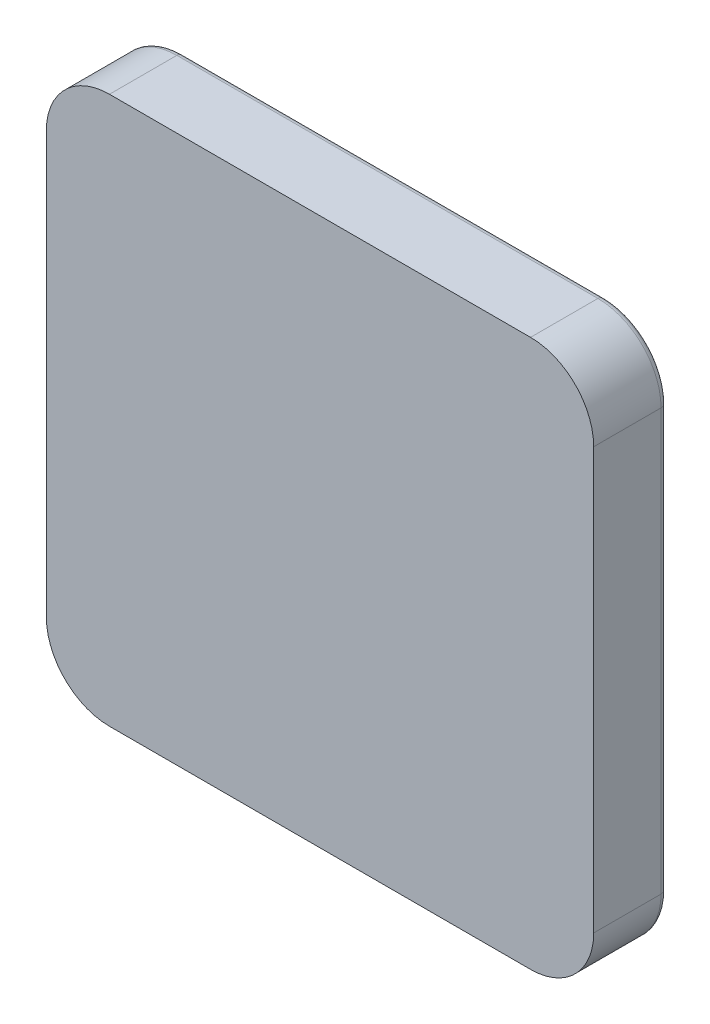
ISO-10303-21;
HEADER;
FILE_DESCRIPTION(('STEP AP214'),'2;1');
FILE_NAME('part.step','',(''),(''),'','','');
FILE_SCHEMA(('AUTOMOTIVE_DESIGN { 1 0 10303 214 1 1 1 1 }'));
ENDSEC;
DATA;
#1=APPLICATION_CONTEXT('core data for automotive mechanical design processes');
#2=APPLICATION_PROTOCOL_DEFINITION('international standard','automotive_design',2000,#1);
#3=PRODUCT_CONTEXT('',#1,'mechanical');
#4=PRODUCT('Part','Part','',(#3));
#5=PRODUCT_RELATED_PRODUCT_CATEGORY('part','',(#4));
#6=PRODUCT_DEFINITION_FORMATION('','',#4);
#7=PRODUCT_DEFINITION_CONTEXT('part definition',#1,'design');
#8=PRODUCT_DEFINITION('design','',#6,#7);
#9=PRODUCT_DEFINITION_SHAPE('','',#8);
#10=(LENGTH_UNIT() NAMED_UNIT(*) SI_UNIT(.MILLI.,.METRE.));
#11=(NAMED_UNIT(*) PLANE_ANGLE_UNIT() SI_UNIT($,.RADIAN.));
#12=(NAMED_UNIT(*) SI_UNIT($,.STERADIAN.) SOLID_ANGLE_UNIT());
#13=UNCERTAINTY_MEASURE_WITH_UNIT(LENGTH_MEASURE(1.E-05),#10,'distance_accuracy_value','');
#14=(GEOMETRIC_REPRESENTATION_CONTEXT(3) GLOBAL_UNCERTAINTY_ASSIGNED_CONTEXT((#13)) GLOBAL_UNIT_ASSIGNED_CONTEXT((#10,
#11,#12)) REPRESENTATION_CONTEXT('',''));
#15=CARTESIAN_POINT('',(0.,0.,0.));
#16=DIRECTION('',(0.,0.,1.));
#17=DIRECTION('',(1.,0.,0.));
#18=AXIS2_PLACEMENT_3D('',#15,#16,#17);
#19=CARTESIAN_POINT('',(1.,1.,-0.35));
#20=DIRECTION('',(0.,0.,-1.));
#21=DIRECTION('',(-1.,0.,0.));
#22=AXIS2_PLACEMENT_3D('',#19,#20,#21);
#23=PLANE('',#22);
#24=CARTESIAN_POINT('',(1.,1.,-0.35));
#25=DIRECTION('',(0.,0.,1.));
#26=DIRECTION('',(1.,0.,0.));
#27=AXIS2_PLACEMENT_3D('',#24,#25,#26);
#28=CIRCLE('',#27,0.27);
#29=CARTESIAN_POINT('',(1.,1.27,-0.35));
#30=VERTEX_POINT('',#29);
#31=CARTESIAN_POINT('',(1.27,1.,-0.35));
#32=VERTEX_POINT('',#31);
#33=EDGE_CURVE('E229',#30,#32,#28,.F.);
#34=ORIENTED_EDGE('',*,*,#33,.T.);
#35=DIRECTION('',(0.,1.,0.));
#36=VECTOR('',#35,1.);
#37=CARTESIAN_POINT('',(1.27,1.,-0.35));
#38=LINE('',#37,#36);
#39=CARTESIAN_POINT('',(1.27,-1.,-0.35));
#40=VERTEX_POINT('',#39);
#41=EDGE_CURVE('E238',#40,#32,#38,.T.);
#42=ORIENTED_EDGE('',*,*,#41,.F.);
#43=CARTESIAN_POINT('',(1.,-1.,-0.35));
#44=DIRECTION('',(0.,0.,1.));
#45=DIRECTION('',(0.,-1.,0.));
#46=AXIS2_PLACEMENT_3D('',#43,#44,#45);
#47=CIRCLE('',#46,0.27);
#48=CARTESIAN_POINT('',(1.,-1.27,-0.35));
#49=VERTEX_POINT('',#48);
#50=EDGE_CURVE('E330',#49,#40,#47,.T.);
#51=ORIENTED_EDGE('',*,*,#50,.F.);
#52=DIRECTION('',(1.,0.,0.));
#53=VECTOR('',#52,1.);
#54=CARTESIAN_POINT('',(1.,-1.27,-0.35));
#55=LINE('',#54,#53);
#56=CARTESIAN_POINT('',(-1.,-1.27,-0.35));
#57=VERTEX_POINT('',#56);
#58=EDGE_CURVE('E283',#57,#49,#55,.T.);
#59=ORIENTED_EDGE('',*,*,#58,.F.);
#60=CARTESIAN_POINT('',(-1.,-1.,-0.35));
#61=DIRECTION('',(0.,0.,1.));
#62=DIRECTION('',(-1.,0.,0.));
#63=AXIS2_PLACEMENT_3D('',#60,#61,#62);
#64=CIRCLE('',#63,0.27);
#65=CARTESIAN_POINT('',(-1.27,-1.,-0.35));
#66=VERTEX_POINT('',#65);
#67=EDGE_CURVE('E291',#66,#57,#64,.T.);
#68=ORIENTED_EDGE('',*,*,#67,.F.);
#69=DIRECTION('',(0.,-1.,0.));
#70=VECTOR('',#69,1.);
#71=CARTESIAN_POINT('',(-1.27,1.,-0.35));
#72=LINE('',#71,#70);
#73=CARTESIAN_POINT('',(-1.27,1.,-0.35));
#74=VERTEX_POINT('',#73);
#75=EDGE_CURVE('E323',#74,#66,#72,.T.);
#76=ORIENTED_EDGE('',*,*,#75,.F.);
#77=CARTESIAN_POINT('',(-1.,1.,-0.35));
#78=DIRECTION('',(0.,0.,1.));
#79=DIRECTION('',(0.,1.,0.));
#80=AXIS2_PLACEMENT_3D('',#77,#78,#79);
#81=CIRCLE('',#80,0.27);
#82=CARTESIAN_POINT('',(-1.,1.27,-0.35));
#83=VERTEX_POINT('',#82);
#84=EDGE_CURVE('E242',#83,#74,#81,.T.);
#85=ORIENTED_EDGE('',*,*,#84,.F.);
#86=DIRECTION('',(-1.,0.,0.));
#87=VECTOR('',#86,1.);
#88=CARTESIAN_POINT('',(1.,1.27,-0.35));
#89=LINE('',#88,#87);
#90=EDGE_CURVE('E240',#30,#83,#89,.T.);
#91=ORIENTED_EDGE('',*,*,#90,.F.);
#92=EDGE_LOOP('',(#34,#42,#51,#59,#68,#76,#85,#91));
#93=FACE_BOUND('',#92,.T.);
#94=ADVANCED_FACE('F17',(#93),#23,.T.);
#95=CARTESIAN_POINT('',(1.27,1.,-0.32));
#96=DIRECTION('',(0.,1.,0.));
#97=DIRECTION('',(0.,0.,1.));
#98=AXIS2_PLACEMENT_3D('',#95,#96,#97);
#99=CYLINDRICAL_SURFACE('',#98,0.03);
#100=CARTESIAN_POINT('',(1.27,-1.,-0.32));
#101=DIRECTION('',(0.,-1.,0.));
#102=DIRECTION('',(1.,0.,0.));
#103=AXIS2_PLACEMENT_3D('',#100,#101,#102);
#104=CIRCLE('',#103,0.03);
#105=CARTESIAN_POINT('',(1.3,-1.,-0.32));
#106=VERTEX_POINT('',#105);
#107=EDGE_CURVE('E335',#40,#106,#104,.T.);
#108=ORIENTED_EDGE('',*,*,#107,.F.);
#109=ORIENTED_EDGE('',*,*,#41,.T.);
#110=CARTESIAN_POINT('',(1.27,1.,-0.32));
#111=DIRECTION('',(0.,-1.,0.));
#112=DIRECTION('',(1.,0.,0.));
#113=AXIS2_PLACEMENT_3D('',#110,#111,#112);
#114=CIRCLE('',#113,0.03);
#115=CARTESIAN_POINT('',(1.3,1.,-0.32));
#116=VERTEX_POINT('',#115);
#117=EDGE_CURVE('E237',#116,#32,#114,.F.);
#118=ORIENTED_EDGE('',*,*,#117,.F.);
#119=DIRECTION('',(0.,1.,0.));
#120=VECTOR('',#119,1.);
#121=CARTESIAN_POINT('',(1.3,1.,-0.32));
#122=LINE('',#121,#120);
#123=EDGE_CURVE('E249',#106,#116,#122,.T.);
#124=ORIENTED_EDGE('',*,*,#123,.F.);
#125=EDGE_LOOP('',(#108,#109,#118,#124));
#126=FACE_BOUND('',#125,.T.);
#127=ADVANCED_FACE('F340',(#126),#99,.T.);
#128=CARTESIAN_POINT('',(1.,-1.,-0.32));
#129=DIRECTION('',(0.,0.,-1.));
#130=DIRECTION('',(-1.,0.,0.));
#131=AXIS2_PLACEMENT_3D('',#128,#129,#130);
#132=TOROIDAL_SURFACE('',#131,0.27,0.03);
#133=CARTESIAN_POINT('',(1.,-1.27,-0.32));
#134=DIRECTION('',(1.,0.,0.));
#135=DIRECTION('',(0.,1.,0.));
#136=AXIS2_PLACEMENT_3D('',#133,#134,#135);
#137=CIRCLE('',#136,0.03);
#138=CARTESIAN_POINT('',(1.,-1.3,-0.32));
#139=VERTEX_POINT('',#138);
#140=EDGE_CURVE('E292',#49,#139,#137,.F.);
#141=ORIENTED_EDGE('',*,*,#140,.F.);
#142=ORIENTED_EDGE('',*,*,#50,.T.);
#143=ORIENTED_EDGE('',*,*,#107,.T.);
#144=CARTESIAN_POINT('',(1.,-1.,-0.32));
#145=DIRECTION('',(0.,0.,1.));
#146=DIRECTION('',(1.,0.,0.));
#147=AXIS2_PLACEMENT_3D('',#144,#145,#146);
#148=CIRCLE('',#147,0.3);
#149=EDGE_CURVE('E126',#139,#106,#148,.T.);
#150=ORIENTED_EDGE('',*,*,#149,.F.);
#151=EDGE_LOOP('',(#141,#142,#143,#150));
#152=FACE_BOUND('',#151,.T.);
#153=ADVANCED_FACE('F337',(#152),#132,.T.);
#154=CARTESIAN_POINT('',(1.,-1.27,-0.32));
#155=DIRECTION('',(1.,0.,0.));
#156=DIRECTION('',(0.,1.,0.));
#157=AXIS2_PLACEMENT_3D('',#154,#155,#156);
#158=CYLINDRICAL_SURFACE('',#157,0.03);
#159=CARTESIAN_POINT('',(-1.,-1.27,-0.32));
#160=DIRECTION('',(-1.,0.,0.));
#161=DIRECTION('',(0.,-1.,0.));
#162=AXIS2_PLACEMENT_3D('',#159,#160,#161);
#163=CIRCLE('',#162,0.03);
#164=CARTESIAN_POINT('',(-1.,-1.3,-0.32));
#165=VERTEX_POINT('',#164);
#166=EDGE_CURVE('E321',#57,#165,#163,.T.);
#167=ORIENTED_EDGE('',*,*,#166,.F.);
#168=ORIENTED_EDGE('',*,*,#58,.T.);
#169=ORIENTED_EDGE('',*,*,#140,.T.);
#170=DIRECTION('',(1.,0.,0.));
#171=VECTOR('',#170,1.);
#172=CARTESIAN_POINT('',(1.,-1.3,-0.32));
#173=LINE('',#172,#171);
#174=EDGE_CURVE('E75',#165,#139,#173,.T.);
#175=ORIENTED_EDGE('',*,*,#174,.F.);
#176=EDGE_LOOP('',(#167,#168,#169,#175));
#177=FACE_BOUND('',#176,.T.);
#178=ADVANCED_FACE('F314',(#177),#158,.T.);
#179=CARTESIAN_POINT('',(-1.,-1.,-0.32));
#180=DIRECTION('',(0.,0.,-1.));
#181=DIRECTION('',(-1.,0.,0.));
#182=AXIS2_PLACEMENT_3D('',#179,#180,#181);
#183=TOROIDAL_SURFACE('',#182,0.27,0.03);
#184=ORIENTED_EDGE('',*,*,#166,.T.);
#185=CARTESIAN_POINT('',(-1.,-1.,-0.32));
#186=DIRECTION('',(0.,0.,1.));
#187=DIRECTION('',(1.,0.,0.));
#188=AXIS2_PLACEMENT_3D('',#185,#186,#187);
#189=CIRCLE('',#188,0.3);
#190=CARTESIAN_POINT('',(-1.3,-1.,-0.32));
#191=VERTEX_POINT('',#190);
#192=EDGE_CURVE('E77',#191,#165,#189,.T.);
#193=ORIENTED_EDGE('',*,*,#192,.F.);
#194=CARTESIAN_POINT('',(-1.27,-1.,-0.32));
#195=DIRECTION('',(0.,-1.,0.));
#196=DIRECTION('',(0.,0.,-1.));
#197=AXIS2_PLACEMENT_3D('',#194,#195,#196);
#198=CIRCLE('',#197,0.03);
#199=EDGE_CURVE('E421',#66,#191,#198,.F.);
#200=ORIENTED_EDGE('',*,*,#199,.F.);
#201=ORIENTED_EDGE('',*,*,#67,.T.);
#202=EDGE_LOOP('',(#184,#193,#200,#201));
#203=FACE_BOUND('',#202,.T.);
#204=ADVANCED_FACE('F304',(#203),#183,.T.);
#205=CARTESIAN_POINT('',(-1.27,1.,-0.32));
#206=DIRECTION('',(0.,-1.,0.));
#207=DIRECTION('',(0.,0.,-1.));
#208=AXIS2_PLACEMENT_3D('',#205,#206,#207);
#209=CYLINDRICAL_SURFACE('',#208,0.03);
#210=ORIENTED_EDGE('',*,*,#199,.T.);
#211=DIRECTION('',(0.,1.,0.));
#212=VECTOR('',#211,1.);
#213=CARTESIAN_POINT('',(-1.3,1.,-0.32));
#214=LINE('',#213,#212);
#215=CARTESIAN_POINT('',(-1.3,1.,-0.32));
#216=VERTEX_POINT('',#215);
#217=EDGE_CURVE('E116',#216,#191,#214,.F.);
#218=ORIENTED_EDGE('',*,*,#217,.F.);
#219=CARTESIAN_POINT('',(-1.27,1.,-0.32));
#220=DIRECTION('',(0.,1.,0.));
#221=DIRECTION('',(-1.,0.,0.));
#222=AXIS2_PLACEMENT_3D('',#219,#220,#221);
#223=CIRCLE('',#222,0.03);
#224=EDGE_CURVE('E193',#74,#216,#223,.T.);
#225=ORIENTED_EDGE('',*,*,#224,.F.);
#226=ORIENTED_EDGE('',*,*,#75,.T.);
#227=EDGE_LOOP('',(#210,#218,#225,#226));
#228=FACE_BOUND('',#227,.T.);
#229=ADVANCED_FACE('F275',(#228),#209,.T.);
#230=CARTESIAN_POINT('',(-1.,1.,-0.32));
#231=DIRECTION('',(0.,0.,-1.));
#232=DIRECTION('',(-1.,0.,0.));
#233=AXIS2_PLACEMENT_3D('',#230,#231,#232);
#234=TOROIDAL_SURFACE('',#233,0.27,0.03);
#235=ORIENTED_EDGE('',*,*,#224,.T.);
#236=CARTESIAN_POINT('',(-1.,1.,-0.32));
#237=DIRECTION('',(0.,0.,1.));
#238=DIRECTION('',(1.,0.,0.));
#239=AXIS2_PLACEMENT_3D('',#236,#237,#238);
#240=CIRCLE('',#239,0.3);
#241=CARTESIAN_POINT('',(-1.,1.3,-0.32));
#242=VERTEX_POINT('',#241);
#243=EDGE_CURVE('E111',#242,#216,#240,.T.);
#244=ORIENTED_EDGE('',*,*,#243,.F.);
#245=CARTESIAN_POINT('',(-1.,1.27,-0.32));
#246=DIRECTION('',(-1.,0.,0.));
#247=DIRECTION('',(0.,0.,1.));
#248=AXIS2_PLACEMENT_3D('',#245,#246,#247);
#249=CIRCLE('',#248,0.03);
#250=EDGE_CURVE('E246',#83,#242,#249,.F.);
#251=ORIENTED_EDGE('',*,*,#250,.F.);
#252=ORIENTED_EDGE('',*,*,#84,.T.);
#253=EDGE_LOOP('',(#235,#244,#251,#252));
#254=FACE_BOUND('',#253,.T.);
#255=ADVANCED_FACE('F271',(#254),#234,.T.);
#256=CARTESIAN_POINT('',(1.,1.27,-0.32));
#257=DIRECTION('',(-1.,0.,0.));
#258=DIRECTION('',(0.,0.,1.));
#259=AXIS2_PLACEMENT_3D('',#256,#257,#258);
#260=CYLINDRICAL_SURFACE('',#259,0.03);
#261=ORIENTED_EDGE('',*,*,#250,.T.);
#262=DIRECTION('',(1.,0.,0.));
#263=VECTOR('',#262,1.);
#264=CARTESIAN_POINT('',(1.,1.3,-0.32));
#265=LINE('',#264,#263);
#266=CARTESIAN_POINT('',(1.,1.3,-0.32));
#267=VERTEX_POINT('',#266);
#268=EDGE_CURVE('E106',#267,#242,#265,.F.);
#269=ORIENTED_EDGE('',*,*,#268,.F.);
#270=CARTESIAN_POINT('',(1.,1.27,-0.32));
#271=DIRECTION('',(1.,0.,0.));
#272=DIRECTION('',(0.,1.,0.));
#273=AXIS2_PLACEMENT_3D('',#270,#271,#272);
#274=CIRCLE('',#273,0.03);
#275=EDGE_CURVE('E138',#30,#267,#274,.T.);
#276=ORIENTED_EDGE('',*,*,#275,.F.);
#277=ORIENTED_EDGE('',*,*,#90,.T.);
#278=EDGE_LOOP('',(#261,#269,#276,#277));
#279=FACE_BOUND('',#278,.T.);
#280=ADVANCED_FACE('F147',(#279),#260,.T.);
#281=CARTESIAN_POINT('',(1.,1.,-0.32));
#282=DIRECTION('',(0.,0.,-1.));
#283=DIRECTION('',(-1.,0.,0.));
#284=AXIS2_PLACEMENT_3D('',#281,#282,#283);
#285=TOROIDAL_SURFACE('',#284,0.27,0.03);
#286=ORIENTED_EDGE('',*,*,#275,.T.);
#287=CARTESIAN_POINT('',(1.,1.,-0.32));
#288=DIRECTION('',(0.,0.,1.));
#289=DIRECTION('',(1.,0.,0.));
#290=AXIS2_PLACEMENT_3D('',#287,#288,#289);
#291=CIRCLE('',#290,0.3);
#292=EDGE_CURVE('E93',#116,#267,#291,.T.);
#293=ORIENTED_EDGE('',*,*,#292,.F.);
#294=ORIENTED_EDGE('',*,*,#117,.T.);
#295=ORIENTED_EDGE('',*,*,#33,.F.);
#296=EDGE_LOOP('',(#286,#293,#294,#295));
#297=FACE_BOUND('',#296,.T.);
#298=ADVANCED_FACE('F141',(#297),#285,.T.);
#299=CARTESIAN_POINT('',(1.3,1.,-0.35));
#300=DIRECTION('',(1.,0.,0.));
#301=DIRECTION('',(0.,0.,-1.));
#302=AXIS2_PLACEMENT_3D('',#299,#300,#301);
#303=PLANE('',#302);
#304=DIRECTION('',(0.,0.,1.));
#305=VECTOR('',#304,1.);
#306=CARTESIAN_POINT('',(1.3,1.,-0.35));
#307=LINE('',#306,#305);
#308=CARTESIAN_POINT('',(1.3,1.,0.));
#309=VERTEX_POINT('',#308);
#310=EDGE_CURVE('E99',#309,#116,#307,.F.);
#311=ORIENTED_EDGE('',*,*,#310,.F.);
#312=DIRECTION('',(0.,1.,0.));
#313=VECTOR('',#312,1.);
#314=CARTESIAN_POINT('',(1.3,1.,0.));
#315=LINE('',#314,#313);
#316=CARTESIAN_POINT('',(1.3,-1.,0.));
#317=VERTEX_POINT('',#316);
#318=EDGE_CURVE('E89',#309,#317,#315,.F.);
#319=ORIENTED_EDGE('',*,*,#318,.T.);
#320=DIRECTION('',(0.,0.,1.));
#321=VECTOR('',#320,1.);
#322=CARTESIAN_POINT('',(1.3,-1.,-0.35));
#323=LINE('',#322,#321);
#324=EDGE_CURVE('E61',#106,#317,#323,.T.);
#325=ORIENTED_EDGE('',*,*,#324,.F.);
#326=ORIENTED_EDGE('',*,*,#123,.T.);
#327=EDGE_LOOP('',(#311,#319,#325,#326));
#328=FACE_BOUND('',#327,.T.);
#329=ADVANCED_FACE('F146',(#328),#303,.T.);
#330=CARTESIAN_POINT('',(1.,-1.,-0.35));
#331=DIRECTION('',(0.,0.,1.));
#332=DIRECTION('',(1.,0.,0.));
#333=AXIS2_PLACEMENT_3D('',#330,#331,#332);
#334=CYLINDRICAL_SURFACE('',#333,0.3);
#335=ORIENTED_EDGE('',*,*,#324,.T.);
#336=CARTESIAN_POINT('',(1.,-1.,0.));
#337=DIRECTION('',(0.,0.,1.));
#338=DIRECTION('',(1.,0.,0.));
#339=AXIS2_PLACEMENT_3D('',#336,#337,#338);
#340=CIRCLE('',#339,0.3);
#341=CARTESIAN_POINT('',(1.,-1.3,0.));
#342=VERTEX_POINT('',#341);
#343=EDGE_CURVE('E21',#317,#342,#340,.F.);
#344=ORIENTED_EDGE('',*,*,#343,.T.);
#345=DIRECTION('',(0.,0.,1.));
#346=VECTOR('',#345,1.);
#347=CARTESIAN_POINT('',(1.,-1.3,-0.35));
#348=LINE('',#347,#346);
#349=EDGE_CURVE('E68',#139,#342,#348,.T.);
#350=ORIENTED_EDGE('',*,*,#349,.F.);
#351=ORIENTED_EDGE('',*,*,#149,.T.);
#352=EDGE_LOOP('',(#335,#344,#350,#351));
#353=FACE_BOUND('',#352,.T.);
#354=ADVANCED_FACE('F88',(#353),#334,.T.);
#355=CARTESIAN_POINT('',(1.,-1.3,-0.35));
#356=DIRECTION('',(0.,-1.,0.));
#357=DIRECTION('',(1.,0.,0.));
#358=AXIS2_PLACEMENT_3D('',#355,#356,#357);
#359=PLANE('',#358);
#360=ORIENTED_EDGE('',*,*,#349,.T.);
#361=DIRECTION('',(-1.,0.,0.));
#362=VECTOR('',#361,1.);
#363=CARTESIAN_POINT('',(1.,-1.3,0.));
#364=LINE('',#363,#362);
#365=CARTESIAN_POINT('',(-1.,-1.3,0.));
#366=VERTEX_POINT('',#365);
#367=EDGE_CURVE('E72',#342,#366,#364,.T.);
#368=ORIENTED_EDGE('',*,*,#367,.T.);
#369=DIRECTION('',(0.,0.,1.));
#370=VECTOR('',#369,1.);
#371=CARTESIAN_POINT('',(-1.,-1.3,-0.35));
#372=LINE('',#371,#370);
#373=EDGE_CURVE('E119',#165,#366,#372,.T.);
#374=ORIENTED_EDGE('',*,*,#373,.F.);
#375=ORIENTED_EDGE('',*,*,#174,.T.);
#376=EDGE_LOOP('',(#360,#368,#374,#375));
#377=FACE_BOUND('',#376,.T.);
#378=ADVANCED_FACE('F70',(#377),#359,.T.);
#379=CARTESIAN_POINT('',(-1.,-1.,-0.35));
#380=DIRECTION('',(0.,0.,1.));
#381=DIRECTION('',(1.,0.,0.));
#382=AXIS2_PLACEMENT_3D('',#379,#380,#381);
#383=CYLINDRICAL_SURFACE('',#382,0.3);
#384=ORIENTED_EDGE('',*,*,#373,.T.);
#385=CARTESIAN_POINT('',(-1.,-1.,0.));
#386=DIRECTION('',(0.,0.,1.));
#387=DIRECTION('',(1.,0.,0.));
#388=AXIS2_PLACEMENT_3D('',#385,#386,#387);
#389=CIRCLE('',#388,0.3);
#390=CARTESIAN_POINT('',(-1.3,-1.,0.));
#391=VERTEX_POINT('',#390);
#392=EDGE_CURVE('E86',#366,#391,#389,.F.);
#393=ORIENTED_EDGE('',*,*,#392,.T.);
#394=DIRECTION('',(0.,0.,1.));
#395=VECTOR('',#394,1.);
#396=CARTESIAN_POINT('',(-1.3,-1.,-0.35));
#397=LINE('',#396,#395);
#398=EDGE_CURVE('E114',#191,#391,#397,.T.);
#399=ORIENTED_EDGE('',*,*,#398,.F.);
#400=ORIENTED_EDGE('',*,*,#192,.T.);
#401=EDGE_LOOP('',(#384,#393,#399,#400));
#402=FACE_BOUND('',#401,.T.);
#403=ADVANCED_FACE('F370',(#402),#383,.T.);
#404=CARTESIAN_POINT('',(-1.3,1.,-0.35));
#405=DIRECTION('',(-1.,0.,0.));
#406=DIRECTION('',(0.,0.,1.));
#407=AXIS2_PLACEMENT_3D('',#404,#405,#406);
#408=PLANE('',#407);
#409=ORIENTED_EDGE('',*,*,#398,.T.);
#410=DIRECTION('',(0.,1.,0.));
#411=VECTOR('',#410,1.);
#412=CARTESIAN_POINT('',(-1.3,1.,0.));
#413=LINE('',#412,#411);
#414=CARTESIAN_POINT('',(-1.3,1.,0.));
#415=VERTEX_POINT('',#414);
#416=EDGE_CURVE('E165',#391,#415,#413,.T.);
#417=ORIENTED_EDGE('',*,*,#416,.T.);
#418=DIRECTION('',(0.,0.,1.));
#419=VECTOR('',#418,1.);
#420=CARTESIAN_POINT('',(-1.3,1.,-0.35));
#421=LINE('',#420,#419);
#422=EDGE_CURVE('E109',#216,#415,#421,.T.);
#423=ORIENTED_EDGE('',*,*,#422,.F.);
#424=ORIENTED_EDGE('',*,*,#217,.T.);
#425=EDGE_LOOP('',(#409,#417,#423,#424));
#426=FACE_BOUND('',#425,.T.);
#427=ADVANCED_FACE('F185',(#426),#408,.T.);
#428=CARTESIAN_POINT('',(-1.,1.,-0.35));
#429=DIRECTION('',(0.,0.,1.));
#430=DIRECTION('',(1.,0.,0.));
#431=AXIS2_PLACEMENT_3D('',#428,#429,#430);
#432=CYLINDRICAL_SURFACE('',#431,0.3);
#433=ORIENTED_EDGE('',*,*,#422,.T.);
#434=CARTESIAN_POINT('',(-1.,1.,0.));
#435=DIRECTION('',(0.,0.,1.));
#436=DIRECTION('',(1.,0.,0.));
#437=AXIS2_PLACEMENT_3D('',#434,#435,#436);
#438=CIRCLE('',#437,0.3);
#439=CARTESIAN_POINT('',(-1.,1.3,0.));
#440=VERTEX_POINT('',#439);
#441=EDGE_CURVE('E163',#415,#440,#438,.F.);
#442=ORIENTED_EDGE('',*,*,#441,.T.);
#443=DIRECTION('',(0.,0.,1.));
#444=VECTOR('',#443,1.);
#445=CARTESIAN_POINT('',(-1.,1.3,-0.35));
#446=LINE('',#445,#444);
#447=EDGE_CURVE('E102',#242,#440,#446,.T.);
#448=ORIENTED_EDGE('',*,*,#447,.F.);
#449=ORIENTED_EDGE('',*,*,#243,.T.);
#450=EDGE_LOOP('',(#433,#442,#448,#449));
#451=FACE_BOUND('',#450,.T.);
#452=ADVANCED_FACE('F178',(#451),#432,.T.);
#453=CARTESIAN_POINT('',(1.,1.3,-0.35));
#454=DIRECTION('',(0.,1.,0.));
#455=DIRECTION('',(0.,0.,1.));
#456=AXIS2_PLACEMENT_3D('',#453,#454,#455);
#457=PLANE('',#456);
#458=ORIENTED_EDGE('',*,*,#447,.T.);
#459=DIRECTION('',(-1.,0.,0.));
#460=VECTOR('',#459,1.);
#461=CARTESIAN_POINT('',(1.,1.3,0.));
#462=LINE('',#461,#460);
#463=CARTESIAN_POINT('',(1.,1.3,0.));
#464=VERTEX_POINT('',#463);
#465=EDGE_CURVE('E27',#440,#464,#462,.F.);
#466=ORIENTED_EDGE('',*,*,#465,.T.);
#467=DIRECTION('',(0.,0.,1.));
#468=VECTOR('',#467,1.);
#469=CARTESIAN_POINT('',(1.,1.3,-0.35));
#470=LINE('',#469,#468);
#471=EDGE_CURVE('E35',#267,#464,#470,.T.);
#472=ORIENTED_EDGE('',*,*,#471,.F.);
#473=ORIENTED_EDGE('',*,*,#268,.T.);
#474=EDGE_LOOP('',(#458,#466,#472,#473));
#475=FACE_BOUND('',#474,.T.);
#476=ADVANCED_FACE('F174',(#475),#457,.T.);
#477=CARTESIAN_POINT('',(1.,1.,-0.35));
#478=DIRECTION('',(0.,0.,1.));
#479=DIRECTION('',(1.,0.,0.));
#480=AXIS2_PLACEMENT_3D('',#477,#478,#479);
#481=CYLINDRICAL_SURFACE('',#480,0.3);
#482=ORIENTED_EDGE('',*,*,#471,.T.);
#483=CARTESIAN_POINT('',(1.,1.,0.));
#484=DIRECTION('',(0.,0.,1.));
#485=DIRECTION('',(1.,0.,0.));
#486=AXIS2_PLACEMENT_3D('',#483,#484,#485);
#487=CIRCLE('',#486,0.3);
#488=EDGE_CURVE('E11',#464,#309,#487,.F.);
#489=ORIENTED_EDGE('',*,*,#488,.T.);
#490=ORIENTED_EDGE('',*,*,#310,.T.);
#491=ORIENTED_EDGE('',*,*,#292,.T.);
#492=EDGE_LOOP('',(#482,#489,#490,#491));
#493=FACE_BOUND('',#492,.T.);
#494=ADVANCED_FACE('F357',(#493),#481,.T.);
#495=CARTESIAN_POINT('',(1.,1.,0.));
#496=DIRECTION('',(0.,0.,-1.));
#497=DIRECTION('',(-1.,0.,0.));
#498=AXIS2_PLACEMENT_3D('',#495,#496,#497);
#499=PLANE('',#498);
#500=ORIENTED_EDGE('',*,*,#465,.F.);
#501=ORIENTED_EDGE('',*,*,#441,.F.);
#502=ORIENTED_EDGE('',*,*,#416,.F.);
#503=ORIENTED_EDGE('',*,*,#392,.F.);
#504=ORIENTED_EDGE('',*,*,#367,.F.);
#505=ORIENTED_EDGE('',*,*,#343,.F.);
#506=ORIENTED_EDGE('',*,*,#318,.F.);
#507=ORIENTED_EDGE('',*,*,#488,.F.);
#508=EDGE_LOOP('',(#500,#501,#502,#503,#504,#505,#506,#507));
#509=FACE_BOUND('',#508,.T.);
#510=ADVANCED_FACE('F82',(#509),#499,.F.);
#511=CLOSED_SHELL('',(#94,#127,#153,#178,#204,#229,#255,#280,#298,#329,#354,#378,#403,#427,#452,
#476,#494,#510));
#512=MANIFOLD_SOLID_BREP('B1',#511);
#513=ADVANCED_BREP_SHAPE_REPRESENTATION('',(#18,#512),#14);
#514=SHAPE_DEFINITION_REPRESENTATION(#9,#513);
ENDSEC;
END-ISO-10303-21;
